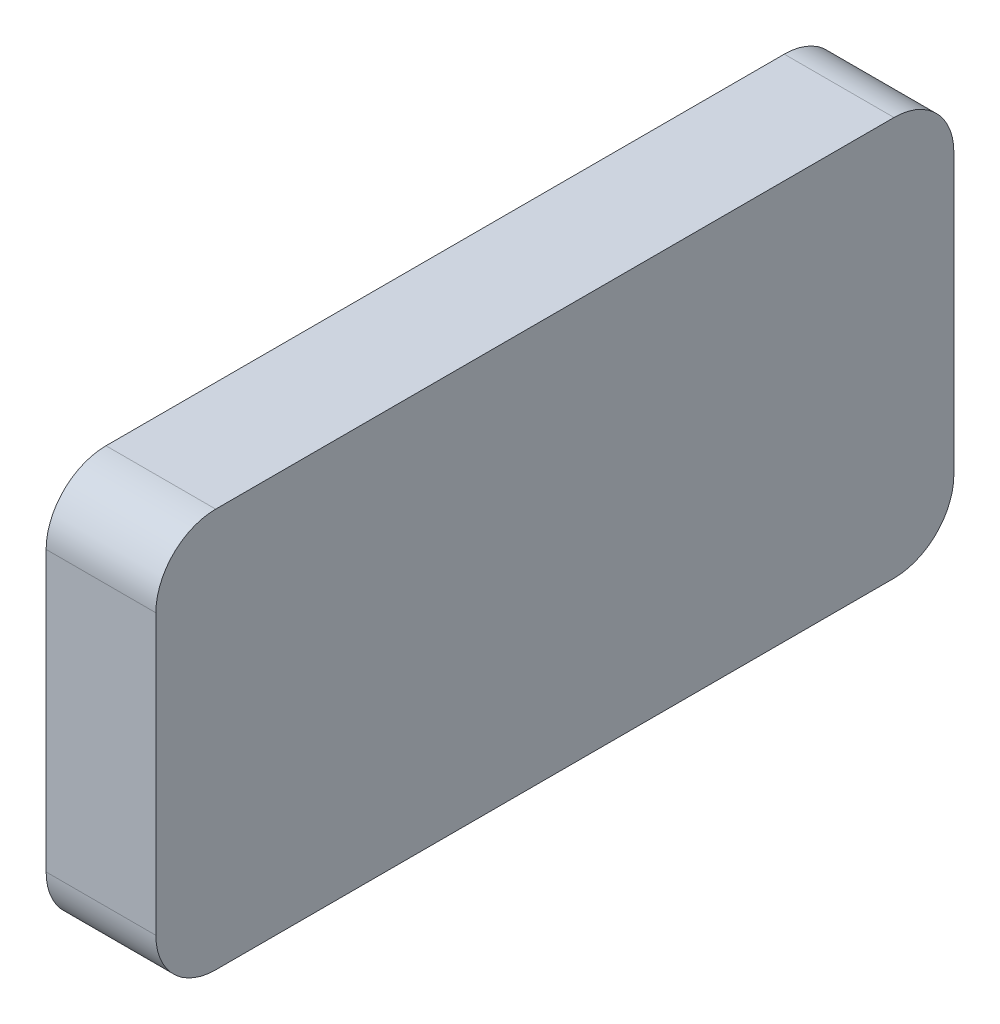
ISO-10303-21;
HEADER;
FILE_DESCRIPTION(('STEP AP214'),'2;1');
FILE_NAME('part.step','',(''),(''),'','','');
FILE_SCHEMA(('AUTOMOTIVE_DESIGN { 1 0 10303 214 1 1 1 1 }'));
ENDSEC;
DATA;
#1=APPLICATION_CONTEXT('core data for automotive mechanical design processes');
#2=APPLICATION_PROTOCOL_DEFINITION('international standard','automotive_design',2000,#1);
#3=PRODUCT_CONTEXT('',#1,'mechanical');
#4=PRODUCT('Part','Part','',(#3));
#5=PRODUCT_RELATED_PRODUCT_CATEGORY('part','',(#4));
#6=PRODUCT_DEFINITION_FORMATION('','',#4);
#7=PRODUCT_DEFINITION_CONTEXT('part definition',#1,'design');
#8=PRODUCT_DEFINITION('design','',#6,#7);
#9=PRODUCT_DEFINITION_SHAPE('','',#8);
#10=(LENGTH_UNIT() NAMED_UNIT(*) SI_UNIT(.MILLI.,.METRE.));
#11=(NAMED_UNIT(*) PLANE_ANGLE_UNIT() SI_UNIT($,.RADIAN.));
#12=(NAMED_UNIT(*) SI_UNIT($,.STERADIAN.) SOLID_ANGLE_UNIT());
#13=UNCERTAINTY_MEASURE_WITH_UNIT(LENGTH_MEASURE(1.E-05),#10,'distance_accuracy_value','');
#14=(GEOMETRIC_REPRESENTATION_CONTEXT(3) GLOBAL_UNCERTAINTY_ASSIGNED_CONTEXT((#13)) GLOBAL_UNIT_ASSIGNED_CONTEXT((#10,
#11,#12)) REPRESENTATION_CONTEXT('',''));
#15=CARTESIAN_POINT('',(0.,0.,0.));
#16=DIRECTION('',(0.,0.,1.));
#17=DIRECTION('',(1.,0.,0.));
#18=AXIS2_PLACEMENT_3D('',#15,#16,#17);
#19=CARTESIAN_POINT('',(66.5,5.8,-21.));
#20=DIRECTION('',(-1.,0.,0.));
#21=DIRECTION('',(0.,0.,1.));
#22=AXIS2_PLACEMENT_3D('',#19,#20,#21);
#23=CYLINDRICAL_SURFACE('',#22,3.);
#24=CARTESIAN_POINT('',(61.,5.8,-21.));
#25=DIRECTION('',(1.,0.,0.));
#26=DIRECTION('',(0.,0.,-1.));
#27=AXIS2_PLACEMENT_3D('',#24,#25,#26);
#28=CIRCLE('',#27,3.);
#29=CARTESIAN_POINT('',(61.,2.8,-21.));
#30=VERTEX_POINT('',#29);
#31=CARTESIAN_POINT('',(61.,5.8,-24.));
#32=VERTEX_POINT('',#31);
#33=EDGE_CURVE('E134',#30,#32,#28,.T.);
#34=ORIENTED_EDGE('',*,*,#33,.T.);
#35=DIRECTION('',(-1.,0.,0.));
#36=VECTOR('',#35,1.);
#37=CARTESIAN_POINT('',(66.5,5.8,-24.));
#38=LINE('',#37,#36);
#39=CARTESIAN_POINT('',(66.5,5.8,-24.));
#40=VERTEX_POINT('',#39);
#41=EDGE_CURVE('E11',#40,#32,#38,.T.);
#42=ORIENTED_EDGE('',*,*,#41,.F.);
#43=CARTESIAN_POINT('',(66.5,5.8,-21.));
#44=DIRECTION('',(1.,0.,0.));
#45=DIRECTION('',(0.,0.,-1.));
#46=AXIS2_PLACEMENT_3D('',#43,#44,#45);
#47=CIRCLE('',#46,3.);
#48=CARTESIAN_POINT('',(66.5,2.8,-21.));
#49=VERTEX_POINT('',#48);
#50=EDGE_CURVE('E146',#49,#40,#47,.T.);
#51=ORIENTED_EDGE('',*,*,#50,.F.);
#52=DIRECTION('',(-1.,0.,0.));
#53=VECTOR('',#52,1.);
#54=CARTESIAN_POINT('',(66.5,2.8,-21.));
#55=LINE('',#54,#53);
#56=EDGE_CURVE('E131',#49,#30,#55,.T.);
#57=ORIENTED_EDGE('',*,*,#56,.T.);
#58=EDGE_LOOP('',(#34,#42,#51,#57));
#59=FACE_BOUND('',#58,.T.);
#60=ADVANCED_FACE('F39',(#59),#23,.T.);
#61=CARTESIAN_POINT('',(66.5,5.8,-24.));
#62=DIRECTION('',(0.,0.,1.));
#63=DIRECTION('',(1.,0.,0.));
#64=AXIS2_PLACEMENT_3D('',#61,#62,#63);
#65=PLANE('',#64);
#66=DIRECTION('',(0.,1.,0.));
#67=VECTOR('',#66,1.);
#68=CARTESIAN_POINT('',(61.,5.8,-24.));
#69=LINE('',#68,#67);
#70=CARTESIAN_POINT('',(61.,19.8,-24.));
#71=VERTEX_POINT('',#70);
#72=EDGE_CURVE('E138',#32,#71,#69,.T.);
#73=ORIENTED_EDGE('',*,*,#72,.T.);
#74=DIRECTION('',(-1.,0.,0.));
#75=VECTOR('',#74,1.);
#76=CARTESIAN_POINT('',(66.5,19.8,-24.));
#77=LINE('',#76,#75);
#78=CARTESIAN_POINT('',(66.5,19.8,-24.));
#79=VERTEX_POINT('',#78);
#80=EDGE_CURVE('E50',#79,#71,#77,.T.);
#81=ORIENTED_EDGE('',*,*,#80,.F.);
#82=DIRECTION('',(0.,1.,0.));
#83=VECTOR('',#82,1.);
#84=CARTESIAN_POINT('',(66.5,5.8,-24.));
#85=LINE('',#84,#83);
#86=EDGE_CURVE('E97',#40,#79,#85,.T.);
#87=ORIENTED_EDGE('',*,*,#86,.F.);
#88=ORIENTED_EDGE('',*,*,#41,.T.);
#89=EDGE_LOOP('',(#73,#81,#87,#88));
#90=FACE_BOUND('',#89,.T.);
#91=ADVANCED_FACE('F182',(#90),#65,.F.);
#92=CARTESIAN_POINT('',(66.5,19.8,-21.));
#93=DIRECTION('',(-1.,0.,0.));
#94=DIRECTION('',(0.,0.,1.));
#95=AXIS2_PLACEMENT_3D('',#92,#93,#94);
#96=CYLINDRICAL_SURFACE('',#95,3.);
#97=CARTESIAN_POINT('',(61.,19.8,-21.));
#98=DIRECTION('',(1.,0.,0.));
#99=DIRECTION('',(0.,0.,-1.));
#100=AXIS2_PLACEMENT_3D('',#97,#98,#99);
#101=CIRCLE('',#100,3.);
#102=CARTESIAN_POINT('',(61.,22.8,-21.));
#103=VERTEX_POINT('',#102);
#104=EDGE_CURVE('E139',#71,#103,#101,.T.);
#105=ORIENTED_EDGE('',*,*,#104,.T.);
#106=DIRECTION('',(-1.,0.,0.));
#107=VECTOR('',#106,1.);
#108=CARTESIAN_POINT('',(66.5,22.8,-21.));
#109=LINE('',#108,#107);
#110=CARTESIAN_POINT('',(66.5,22.8,-21.));
#111=VERTEX_POINT('',#110);
#112=EDGE_CURVE('E157',#111,#103,#109,.T.);
#113=ORIENTED_EDGE('',*,*,#112,.F.);
#114=CARTESIAN_POINT('',(66.5,19.8,-21.));
#115=DIRECTION('',(1.,0.,0.));
#116=DIRECTION('',(0.,0.,-1.));
#117=AXIS2_PLACEMENT_3D('',#114,#115,#116);
#118=CIRCLE('',#117,3.);
#119=EDGE_CURVE('E163',#79,#111,#118,.T.);
#120=ORIENTED_EDGE('',*,*,#119,.F.);
#121=ORIENTED_EDGE('',*,*,#80,.T.);
#122=EDGE_LOOP('',(#105,#113,#120,#121));
#123=FACE_BOUND('',#122,.T.);
#124=ADVANCED_FACE('F162',(#123),#96,.T.);
#125=CARTESIAN_POINT('',(66.5,22.8,-21.));
#126=DIRECTION('',(0.,-1.,0.));
#127=DIRECTION('',(0.,0.,-1.));
#128=AXIS2_PLACEMENT_3D('',#125,#126,#127);
#129=PLANE('',#128);
#130=DIRECTION('',(0.,0.,1.));
#131=VECTOR('',#130,1.);
#132=CARTESIAN_POINT('',(61.,22.8,-21.));
#133=LINE('',#132,#131);
#134=CARTESIAN_POINT('',(61.,22.8,13.));
#135=VERTEX_POINT('',#134);
#136=EDGE_CURVE('E145',#103,#135,#133,.T.);
#137=ORIENTED_EDGE('',*,*,#136,.T.);
#138=DIRECTION('',(-1.,0.,0.));
#139=VECTOR('',#138,1.);
#140=CARTESIAN_POINT('',(66.5,22.8,13.));
#141=LINE('',#140,#139);
#142=CARTESIAN_POINT('',(66.5,22.8,13.));
#143=VERTEX_POINT('',#142);
#144=EDGE_CURVE('E154',#143,#135,#141,.T.);
#145=ORIENTED_EDGE('',*,*,#144,.F.);
#146=DIRECTION('',(0.,0.,1.));
#147=VECTOR('',#146,1.);
#148=CARTESIAN_POINT('',(66.5,22.8,-21.));
#149=LINE('',#148,#147);
#150=EDGE_CURVE('E176',#111,#143,#149,.T.);
#151=ORIENTED_EDGE('',*,*,#150,.F.);
#152=ORIENTED_EDGE('',*,*,#112,.T.);
#153=EDGE_LOOP('',(#137,#145,#151,#152));
#154=FACE_BOUND('',#153,.T.);
#155=ADVANCED_FACE('F175',(#154),#129,.F.);
#156=CARTESIAN_POINT('',(66.5,19.8,13.));
#157=DIRECTION('',(-1.,0.,0.));
#158=DIRECTION('',(0.,0.,1.));
#159=AXIS2_PLACEMENT_3D('',#156,#157,#158);
#160=CYLINDRICAL_SURFACE('',#159,3.);
#161=CARTESIAN_POINT('',(61.,19.8,13.));
#162=DIRECTION('',(1.,0.,0.));
#163=DIRECTION('',(0.,0.,-1.));
#164=AXIS2_PLACEMENT_3D('',#161,#162,#163);
#165=CIRCLE('',#164,3.);
#166=CARTESIAN_POINT('',(61.,19.8,16.));
#167=VERTEX_POINT('',#166);
#168=EDGE_CURVE('E143',#135,#167,#165,.T.);
#169=ORIENTED_EDGE('',*,*,#168,.T.);
#170=DIRECTION('',(-1.,0.,0.));
#171=VECTOR('',#170,1.);
#172=CARTESIAN_POINT('',(66.5,19.8,16.));
#173=LINE('',#172,#171);
#174=CARTESIAN_POINT('',(66.5,19.8,16.));
#175=VERTEX_POINT('',#174);
#176=EDGE_CURVE('E128',#175,#167,#173,.T.);
#177=ORIENTED_EDGE('',*,*,#176,.F.);
#178=CARTESIAN_POINT('',(66.5,19.8,13.));
#179=DIRECTION('',(1.,0.,0.));
#180=DIRECTION('',(0.,0.,-1.));
#181=AXIS2_PLACEMENT_3D('',#178,#179,#180);
#182=CIRCLE('',#181,3.);
#183=EDGE_CURVE('E117',#143,#175,#182,.T.);
#184=ORIENTED_EDGE('',*,*,#183,.F.);
#185=ORIENTED_EDGE('',*,*,#144,.T.);
#186=EDGE_LOOP('',(#169,#177,#184,#185));
#187=FACE_BOUND('',#186,.T.);
#188=ADVANCED_FACE('F172',(#187),#160,.T.);
#189=CARTESIAN_POINT('',(66.5,19.8,16.));
#190=DIRECTION('',(0.,0.,-1.));
#191=DIRECTION('',(-1.,0.,0.));
#192=AXIS2_PLACEMENT_3D('',#189,#190,#191);
#193=PLANE('',#192);
#194=DIRECTION('',(0.,-1.,0.));
#195=VECTOR('',#194,1.);
#196=CARTESIAN_POINT('',(61.,19.8,16.));
#197=LINE('',#196,#195);
#198=CARTESIAN_POINT('',(61.,5.8,16.));
#199=VERTEX_POINT('',#198);
#200=EDGE_CURVE('E124',#167,#199,#197,.T.);
#201=ORIENTED_EDGE('',*,*,#200,.T.);
#202=DIRECTION('',(-1.,0.,0.));
#203=VECTOR('',#202,1.);
#204=CARTESIAN_POINT('',(66.5,5.8,16.));
#205=LINE('',#204,#203);
#206=CARTESIAN_POINT('',(66.5,5.8,16.));
#207=VERTEX_POINT('',#206);
#208=EDGE_CURVE('E122',#207,#199,#205,.T.);
#209=ORIENTED_EDGE('',*,*,#208,.F.);
#210=DIRECTION('',(0.,-1.,0.));
#211=VECTOR('',#210,1.);
#212=CARTESIAN_POINT('',(66.5,19.8,16.));
#213=LINE('',#212,#211);
#214=EDGE_CURVE('E112',#175,#207,#213,.T.);
#215=ORIENTED_EDGE('',*,*,#214,.F.);
#216=ORIENTED_EDGE('',*,*,#176,.T.);
#217=EDGE_LOOP('',(#201,#209,#215,#216));
#218=FACE_BOUND('',#217,.T.);
#219=ADVANCED_FACE('F121',(#218),#193,.F.);
#220=CARTESIAN_POINT('',(66.5,5.8,13.));
#221=DIRECTION('',(-1.,0.,0.));
#222=DIRECTION('',(0.,0.,1.));
#223=AXIS2_PLACEMENT_3D('',#220,#221,#222);
#224=CYLINDRICAL_SURFACE('',#223,3.);
#225=CARTESIAN_POINT('',(61.,5.8,13.));
#226=DIRECTION('',(1.,0.,0.));
#227=DIRECTION('',(0.,0.,-1.));
#228=AXIS2_PLACEMENT_3D('',#225,#226,#227);
#229=CIRCLE('',#228,3.);
#230=CARTESIAN_POINT('',(61.,2.8,13.));
#231=VERTEX_POINT('',#230);
#232=EDGE_CURVE('E84',#199,#231,#229,.T.);
#233=ORIENTED_EDGE('',*,*,#232,.T.);
#234=DIRECTION('',(-1.,0.,0.));
#235=VECTOR('',#234,1.);
#236=CARTESIAN_POINT('',(66.5,2.8,13.));
#237=LINE('',#236,#235);
#238=CARTESIAN_POINT('',(66.5,2.8,13.));
#239=VERTEX_POINT('',#238);
#240=EDGE_CURVE('E130',#239,#231,#237,.T.);
#241=ORIENTED_EDGE('',*,*,#240,.F.);
#242=CARTESIAN_POINT('',(66.5,5.8,13.));
#243=DIRECTION('',(1.,0.,0.));
#244=DIRECTION('',(0.,0.,-1.));
#245=AXIS2_PLACEMENT_3D('',#242,#243,#244);
#246=CIRCLE('',#245,3.);
#247=EDGE_CURVE('E113',#207,#239,#246,.T.);
#248=ORIENTED_EDGE('',*,*,#247,.F.);
#249=ORIENTED_EDGE('',*,*,#208,.T.);
#250=EDGE_LOOP('',(#233,#241,#248,#249));
#251=FACE_BOUND('',#250,.T.);
#252=ADVANCED_FACE('F129',(#251),#224,.T.);
#253=CARTESIAN_POINT('',(66.5,2.8,13.));
#254=DIRECTION('',(0.,1.,0.));
#255=DIRECTION('',(0.,0.,1.));
#256=AXIS2_PLACEMENT_3D('',#253,#254,#255);
#257=PLANE('',#256);
#258=DIRECTION('',(0.,0.,-1.));
#259=VECTOR('',#258,1.);
#260=CARTESIAN_POINT('',(61.,2.8,13.));
#261=LINE('',#260,#259);
#262=EDGE_CURVE('E89',#231,#30,#261,.T.);
#263=ORIENTED_EDGE('',*,*,#262,.T.);
#264=ORIENTED_EDGE('',*,*,#56,.F.);
#265=DIRECTION('',(0.,0.,-1.));
#266=VECTOR('',#265,1.);
#267=CARTESIAN_POINT('',(66.5,2.8,13.));
#268=LINE('',#267,#266);
#269=EDGE_CURVE('E54',#239,#49,#268,.T.);
#270=ORIENTED_EDGE('',*,*,#269,.F.);
#271=ORIENTED_EDGE('',*,*,#240,.T.);
#272=EDGE_LOOP('',(#263,#264,#270,#271));
#273=FACE_BOUND('',#272,.T.);
#274=ADVANCED_FACE('F200',(#273),#257,.F.);
#275=CARTESIAN_POINT('',(66.5,5.8,-21.));
#276=DIRECTION('',(1.,0.,0.));
#277=DIRECTION('',(0.,0.,-1.));
#278=AXIS2_PLACEMENT_3D('',#275,#276,#277);
#279=PLANE('',#278);
#280=ORIENTED_EDGE('',*,*,#50,.T.);
#281=ORIENTED_EDGE('',*,*,#86,.T.);
#282=ORIENTED_EDGE('',*,*,#119,.T.);
#283=ORIENTED_EDGE('',*,*,#150,.T.);
#284=ORIENTED_EDGE('',*,*,#183,.T.);
#285=ORIENTED_EDGE('',*,*,#214,.T.);
#286=ORIENTED_EDGE('',*,*,#247,.T.);
#287=ORIENTED_EDGE('',*,*,#269,.T.);
#288=EDGE_LOOP('',(#280,#281,#282,#283,#284,#285,#286,#287));
#289=FACE_BOUND('',#288,.T.);
#290=ADVANCED_FACE('F111',(#289),#279,.T.);
#291=CARTESIAN_POINT('',(61.,5.8,-21.));
#292=DIRECTION('',(1.,0.,0.));
#293=DIRECTION('',(0.,0.,-1.));
#294=AXIS2_PLACEMENT_3D('',#291,#292,#293);
#295=PLANE('',#294);
#296=ORIENTED_EDGE('',*,*,#33,.F.);
#297=ORIENTED_EDGE('',*,*,#262,.F.);
#298=ORIENTED_EDGE('',*,*,#232,.F.);
#299=ORIENTED_EDGE('',*,*,#200,.F.);
#300=ORIENTED_EDGE('',*,*,#168,.F.);
#301=ORIENTED_EDGE('',*,*,#136,.F.);
#302=ORIENTED_EDGE('',*,*,#104,.F.);
#303=ORIENTED_EDGE('',*,*,#72,.F.);
#304=EDGE_LOOP('',(#296,#297,#298,#299,#300,#301,#302,#303));
#305=FACE_BOUND('',#304,.T.);
#306=ADVANCED_FACE('F166',(#305),#295,.F.);
#307=CLOSED_SHELL('',(#60,#91,#124,#155,#188,#219,#252,#274,#290,#306));
#308=MANIFOLD_SOLID_BREP('B2',#307);
#309=ADVANCED_BREP_SHAPE_REPRESENTATION('',(#18,#308),#14);
#310=SHAPE_DEFINITION_REPRESENTATION(#9,#309);
ENDSEC;
END-ISO-10303-21;
